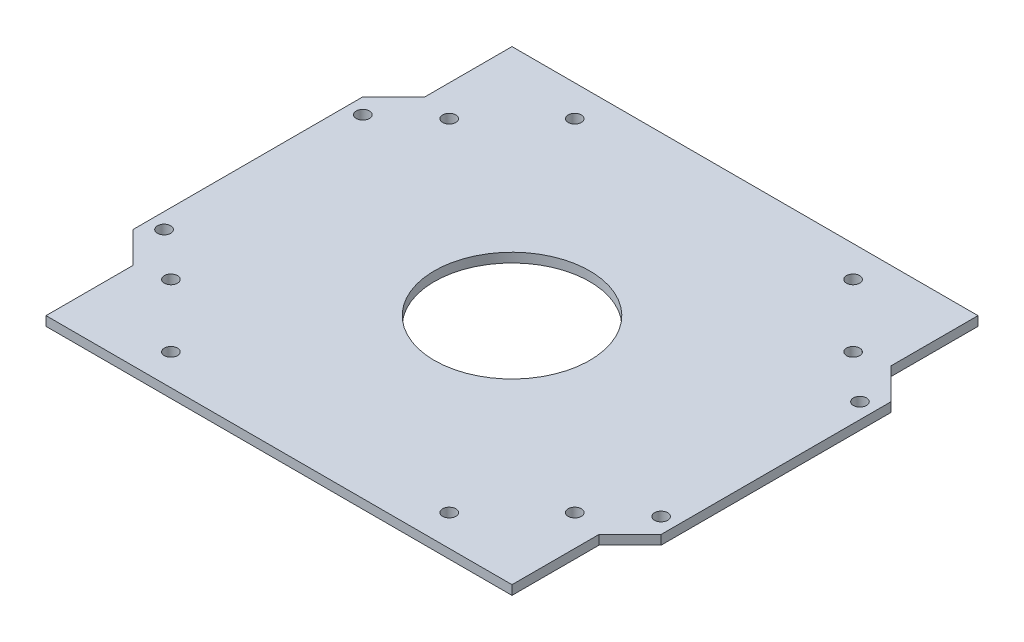
ISO-10303-21;
HEADER;
FILE_DESCRIPTION(('STEP AP214'),'2;1');
FILE_NAME('part.step','',(''),(''),'','','');
FILE_SCHEMA(('AUTOMOTIVE_DESIGN { 1 0 10303 214 1 1 1 1 }'));
ENDSEC;
DATA;
#1=APPLICATION_CONTEXT('core data for automotive mechanical design processes');
#2=APPLICATION_PROTOCOL_DEFINITION('international standard','automotive_design',2000,#1);
#3=PRODUCT_CONTEXT('',#1,'mechanical');
#4=PRODUCT('Part','Part','',(#3));
#5=PRODUCT_RELATED_PRODUCT_CATEGORY('part','',(#4));
#6=PRODUCT_DEFINITION_FORMATION('','',#4);
#7=PRODUCT_DEFINITION_CONTEXT('part definition',#1,'design');
#8=PRODUCT_DEFINITION('design','',#6,#7);
#9=PRODUCT_DEFINITION_SHAPE('','',#8);
#10=(LENGTH_UNIT() NAMED_UNIT(*) SI_UNIT(.MILLI.,.METRE.));
#11=(NAMED_UNIT(*) PLANE_ANGLE_UNIT() SI_UNIT($,.RADIAN.));
#12=(NAMED_UNIT(*) SI_UNIT($,.STERADIAN.) SOLID_ANGLE_UNIT());
#13=UNCERTAINTY_MEASURE_WITH_UNIT(LENGTH_MEASURE(1.E-05),#10,'distance_accuracy_value','');
#14=(GEOMETRIC_REPRESENTATION_CONTEXT(3) GLOBAL_UNCERTAINTY_ASSIGNED_CONTEXT((#13)) GLOBAL_UNIT_ASSIGNED_CONTEXT((#10,
#11,#12)) REPRESENTATION_CONTEXT('',''));
#15=CARTESIAN_POINT('',(0.,0.,0.));
#16=DIRECTION('',(0.,0.,1.));
#17=DIRECTION('',(1.,0.,0.));
#18=AXIS2_PLACEMENT_3D('',#15,#16,#17);
#19=CARTESIAN_POINT('',(75.,3.,75.));
#20=DIRECTION('',(-1.,0.,0.));
#21=DIRECTION('',(0.,0.,1.));
#22=AXIS2_PLACEMENT_3D('',#19,#20,#21);
#23=PLANE('',#22);
#24=DIRECTION('',(0.,1.,0.));
#25=VECTOR('',#24,1.);
#26=CARTESIAN_POINT('',(75.,-14.1421356237309,47.));
#27=LINE('',#26,#25);
#28=CARTESIAN_POINT('',(75.,0.,47.));
#29=VERTEX_POINT('',#28);
#30=CARTESIAN_POINT('',(75.,3.,47.));
#31=VERTEX_POINT('',#30);
#32=EDGE_CURVE('E60',#29,#31,#27,.T.);
#33=ORIENTED_EDGE('',*,*,#32,.T.);
#34=DIRECTION('',(0.,0.,-1.));
#35=VECTOR('',#34,1.);
#36=CARTESIAN_POINT('',(75.,3.,75.));
#37=LINE('',#36,#35);
#38=CARTESIAN_POINT('',(75.,3.,75.));
#39=VERTEX_POINT('',#38);
#40=EDGE_CURVE('E353',#39,#31,#37,.T.);
#41=ORIENTED_EDGE('',*,*,#40,.F.);
#42=DIRECTION('',(0.,-1.,0.));
#43=VECTOR('',#42,1.);
#44=CARTESIAN_POINT('',(75.,3.,75.));
#45=LINE('',#44,#43);
#46=CARTESIAN_POINT('',(75.,0.,75.));
#47=VERTEX_POINT('',#46);
#48=EDGE_CURVE('E172',#39,#47,#45,.T.);
#49=ORIENTED_EDGE('',*,*,#48,.T.);
#50=DIRECTION('',(0.,0.,-1.));
#51=VECTOR('',#50,1.);
#52=CARTESIAN_POINT('',(75.,0.,75.));
#53=LINE('',#52,#51);
#54=EDGE_CURVE('E65',#47,#29,#53,.T.);
#55=ORIENTED_EDGE('',*,*,#54,.T.);
#56=EDGE_LOOP('',(#33,#41,#49,#55));
#57=FACE_BOUND('',#56,.T.);
#58=ADVANCED_FACE('F45',(#57),#23,.F.);
#59=CARTESIAN_POINT('',(-75.,3.,75.));
#60=DIRECTION('',(1.,0.,0.));
#61=DIRECTION('',(0.,0.,-1.));
#62=AXIS2_PLACEMENT_3D('',#59,#60,#61);
#63=PLANE('',#62);
#64=DIRECTION('',(0.,1.,0.));
#65=VECTOR('',#64,1.);
#66=CARTESIAN_POINT('',(-75.,-14.1421356237309,-47.));
#67=LINE('',#66,#65);
#68=CARTESIAN_POINT('',(-75.,0.,-47.));
#69=VERTEX_POINT('',#68);
#70=CARTESIAN_POINT('',(-75.,3.,-47.));
#71=VERTEX_POINT('',#70);
#72=EDGE_CURVE('E205',#69,#71,#67,.T.);
#73=ORIENTED_EDGE('',*,*,#72,.T.);
#74=DIRECTION('',(0.,0.,1.));
#75=VECTOR('',#74,1.);
#76=CARTESIAN_POINT('',(-75.,3.,75.));
#77=LINE('',#76,#75);
#78=CARTESIAN_POINT('',(-75.,3.,-75.));
#79=VERTEX_POINT('',#78);
#80=EDGE_CURVE('E187',#79,#71,#77,.T.);
#81=ORIENTED_EDGE('',*,*,#80,.F.);
#82=DIRECTION('',(0.,-1.,0.));
#83=VECTOR('',#82,1.);
#84=CARTESIAN_POINT('',(-75.,3.,-75.));
#85=LINE('',#84,#83);
#86=CARTESIAN_POINT('',(-75.,0.,-75.));
#87=VERTEX_POINT('',#86);
#88=EDGE_CURVE('E53',#79,#87,#85,.T.);
#89=ORIENTED_EDGE('',*,*,#88,.T.);
#90=DIRECTION('',(0.,0.,1.));
#91=VECTOR('',#90,1.);
#92=CARTESIAN_POINT('',(-75.,0.,75.));
#93=LINE('',#92,#91);
#94=EDGE_CURVE('E161',#87,#69,#93,.T.);
#95=ORIENTED_EDGE('',*,*,#94,.T.);
#96=EDGE_LOOP('',(#73,#81,#89,#95));
#97=FACE_BOUND('',#96,.T.);
#98=ADVANCED_FACE('F184',(#97),#63,.F.);
#99=CARTESIAN_POINT('',(75.,3.,-47.));
#100=VERTEX_POINT('',#99);
#101=CARTESIAN_POINT('',(75.,3.,-75.));
#102=VERTEX_POINT('',#101);
#103=EDGE_CURVE('E171',#100,#102,#37,.T.);
#104=ORIENTED_EDGE('',*,*,#103,.F.);
#105=DIRECTION('',(0.,1.,0.));
#106=VECTOR('',#105,1.);
#107=CARTESIAN_POINT('',(75.,-14.1421356237309,-47.));
#108=LINE('',#107,#106);
#109=CARTESIAN_POINT('',(75.,0.,-47.));
#110=VERTEX_POINT('',#109);
#111=EDGE_CURVE('E218',#110,#100,#108,.T.);
#112=ORIENTED_EDGE('',*,*,#111,.F.);
#113=CARTESIAN_POINT('',(75.,0.,-75.));
#114=VERTEX_POINT('',#113);
#115=EDGE_CURVE('E349',#110,#114,#53,.T.);
#116=ORIENTED_EDGE('',*,*,#115,.T.);
#117=DIRECTION('',(0.,-1.,0.));
#118=VECTOR('',#117,1.);
#119=CARTESIAN_POINT('',(75.,3.,-75.));
#120=LINE('',#119,#118);
#121=EDGE_CURVE('E11',#102,#114,#120,.T.);
#122=ORIENTED_EDGE('',*,*,#121,.F.);
#123=EDGE_LOOP('',(#104,#112,#116,#122));
#124=FACE_BOUND('',#123,.T.);
#125=ADVANCED_FACE('F368',(#124),#23,.F.);
#126=CARTESIAN_POINT('',(-75.,3.,47.));
#127=VERTEX_POINT('',#126);
#128=CARTESIAN_POINT('',(-75.,3.,75.));
#129=VERTEX_POINT('',#128);
#130=EDGE_CURVE('E153',#127,#129,#77,.T.);
#131=ORIENTED_EDGE('',*,*,#130,.F.);
#132=DIRECTION('',(0.,1.,0.));
#133=VECTOR('',#132,1.);
#134=CARTESIAN_POINT('',(-75.,-14.1421356237309,47.));
#135=LINE('',#134,#133);
#136=CARTESIAN_POINT('',(-75.,0.,47.));
#137=VERTEX_POINT('',#136);
#138=EDGE_CURVE('E136',#137,#127,#135,.T.);
#139=ORIENTED_EDGE('',*,*,#138,.F.);
#140=CARTESIAN_POINT('',(-75.,0.,75.));
#141=VERTEX_POINT('',#140);
#142=EDGE_CURVE('E151',#137,#141,#93,.T.);
#143=ORIENTED_EDGE('',*,*,#142,.T.);
#144=DIRECTION('',(0.,-1.,0.));
#145=VECTOR('',#144,1.);
#146=CARTESIAN_POINT('',(-75.,3.,75.));
#147=LINE('',#146,#145);
#148=EDGE_CURVE('E175',#129,#141,#147,.T.);
#149=ORIENTED_EDGE('',*,*,#148,.F.);
#150=EDGE_LOOP('',(#131,#139,#143,#149));
#151=FACE_BOUND('',#150,.T.);
#152=ADVANCED_FACE('F149',(#151),#63,.F.);
#153=CARTESIAN_POINT('',(-75.,3.,-75.));
#154=DIRECTION('',(0.,0.,1.));
#155=DIRECTION('',(1.,0.,0.));
#156=AXIS2_PLACEMENT_3D('',#153,#154,#155);
#157=PLANE('',#156);
#158=DIRECTION('',(-1.,0.,0.));
#159=VECTOR('',#158,1.);
#160=CARTESIAN_POINT('',(-75.,0.,-75.));
#161=LINE('',#160,#159);
#162=EDGE_CURVE('E162',#114,#87,#161,.T.);
#163=ORIENTED_EDGE('',*,*,#162,.T.);
#164=ORIENTED_EDGE('',*,*,#88,.F.);
#165=DIRECTION('',(-1.,0.,0.));
#166=VECTOR('',#165,1.);
#167=CARTESIAN_POINT('',(-75.,3.,-75.));
#168=LINE('',#167,#166);
#169=EDGE_CURVE('E356',#102,#79,#168,.T.);
#170=ORIENTED_EDGE('',*,*,#169,.F.);
#171=ORIENTED_EDGE('',*,*,#121,.T.);
#172=EDGE_LOOP('',(#163,#164,#170,#171));
#173=FACE_BOUND('',#172,.T.);
#174=ADVANCED_FACE('F394',(#173),#157,.F.);
#175=CARTESIAN_POINT('',(-75.,3.,75.));
#176=DIRECTION('',(0.,0.,-1.));
#177=DIRECTION('',(-1.,0.,0.));
#178=AXIS2_PLACEMENT_3D('',#175,#176,#177);
#179=PLANE('',#178);
#180=DIRECTION('',(1.,0.,0.));
#181=VECTOR('',#180,1.);
#182=CARTESIAN_POINT('',(-75.,0.,75.));
#183=LINE('',#182,#181);
#184=EDGE_CURVE('E159',#141,#47,#183,.T.);
#185=ORIENTED_EDGE('',*,*,#184,.T.);
#186=ORIENTED_EDGE('',*,*,#48,.F.);
#187=DIRECTION('',(1.,0.,0.));
#188=VECTOR('',#187,1.);
#189=CARTESIAN_POINT('',(-75.,3.,75.));
#190=LINE('',#189,#188);
#191=EDGE_CURVE('E176',#129,#39,#190,.T.);
#192=ORIENTED_EDGE('',*,*,#191,.F.);
#193=ORIENTED_EDGE('',*,*,#148,.T.);
#194=EDGE_LOOP('',(#185,#186,#192,#193));
#195=FACE_BOUND('',#194,.T.);
#196=ADVANCED_FACE('F396',(#195),#179,.F.);
#197=CARTESIAN_POINT('',(0.,3.,0.));
#198=DIRECTION('',(0.,-1.,0.));
#199=DIRECTION('',(0.,0.,-1.));
#200=AXIS2_PLACEMENT_3D('',#197,#198,#199);
#201=PLANE('',#200);
#202=DIRECTION('',(0.707106781186547,0.,0.707106781186548));
#203=VECTOR('',#202,1.);
#204=CARTESIAN_POINT('',(-85.,3.,37.));
#205=LINE('',#204,#203);
#206=CARTESIAN_POINT('',(-85.,3.,37.));
#207=VERTEX_POINT('',#206);
#208=EDGE_CURVE('E145',#207,#127,#205,.T.);
#209=ORIENTED_EDGE('',*,*,#208,.T.);
#210=ORIENTED_EDGE('',*,*,#130,.T.);
#211=ORIENTED_EDGE('',*,*,#191,.T.);
#212=ORIENTED_EDGE('',*,*,#40,.T.);
#213=DIRECTION('',(-0.707106781186547,0.,0.707106781186548));
#214=VECTOR('',#213,1.);
#215=CARTESIAN_POINT('',(85.,3.,37.));
#216=LINE('',#215,#214);
#217=CARTESIAN_POINT('',(85.,3.,37.));
#218=VERTEX_POINT('',#217);
#219=EDGE_CURVE('E200',#218,#31,#216,.T.);
#220=ORIENTED_EDGE('',*,*,#219,.F.);
#221=DIRECTION('',(0.,0.,-1.));
#222=VECTOR('',#221,1.);
#223=CARTESIAN_POINT('',(85.,3.,37.));
#224=LINE('',#223,#222);
#225=CARTESIAN_POINT('',(85.,3.,-37.));
#226=VERTEX_POINT('',#225);
#227=EDGE_CURVE('E239',#218,#226,#224,.T.);
#228=ORIENTED_EDGE('',*,*,#227,.T.);
#229=DIRECTION('',(-0.707106781186547,0.,-0.707106781186548));
#230=VECTOR('',#229,1.);
#231=CARTESIAN_POINT('',(85.,3.,-37.));
#232=LINE('',#231,#230);
#233=EDGE_CURVE('E211',#226,#100,#232,.T.);
#234=ORIENTED_EDGE('',*,*,#233,.T.);
#235=ORIENTED_EDGE('',*,*,#103,.T.);
#236=ORIENTED_EDGE('',*,*,#169,.T.);
#237=ORIENTED_EDGE('',*,*,#80,.T.);
#238=DIRECTION('',(0.707106781186547,0.,-0.707106781186548));
#239=VECTOR('',#238,1.);
#240=CARTESIAN_POINT('',(-85.,3.,-37.));
#241=LINE('',#240,#239);
#242=CARTESIAN_POINT('',(-85.,3.,-37.));
#243=VERTEX_POINT('',#242);
#244=EDGE_CURVE('E199',#243,#71,#241,.T.);
#245=ORIENTED_EDGE('',*,*,#244,.F.);
#246=DIRECTION('',(0.,0.,1.));
#247=VECTOR('',#246,1.);
#248=CARTESIAN_POINT('',(-85.,3.,37.));
#249=LINE('',#248,#247);
#250=EDGE_CURVE('E253',#243,#207,#249,.T.);
#251=ORIENTED_EDGE('',*,*,#250,.T.);
#252=EDGE_LOOP('',(#209,#210,#211,#212,#220,#228,#234,#235,#236,#237,#245,#251));
#253=FACE_BOUND('',#252,.T.);
#254=CARTESIAN_POINT('',(-65.,3.,-44.8000000000001));
#255=DIRECTION('',(0.,1.,0.));
#256=DIRECTION('',(0.,0.,-1.));
#257=AXIS2_PLACEMENT_3D('',#254,#255,#256);
#258=CIRCLE('',#257,2.125);
#259=CARTESIAN_POINT('',(-65.,3.,-46.9250000000001));
#260=VERTEX_POINT('',#259);
#261=EDGE_CURVE('E313',#260,#260,#258,.T.);
#262=ORIENTED_EDGE('',*,*,#261,.F.);
#263=EDGE_LOOP('',(#262));
#264=FACE_BOUND('',#263,.T.);
#265=CARTESIAN_POINT('',(0.,3.,0.));
#266=DIRECTION('',(0.,1.,0.));
#267=DIRECTION('',(0.,0.,1.));
#268=AXIS2_PLACEMENT_3D('',#265,#266,#267);
#269=CIRCLE('',#268,25.);
#270=CARTESIAN_POINT('',(0.,3.,25.));
#271=VERTEX_POINT('',#270);
#272=EDGE_CURVE('E322',#271,#271,#269,.T.);
#273=ORIENTED_EDGE('',*,*,#272,.F.);
#274=EDGE_LOOP('',(#273));
#275=FACE_BOUND('',#274,.T.);
#276=CARTESIAN_POINT('',(-44.8000000000001,3.,-65.));
#277=DIRECTION('',(0.,1.,0.));
#278=DIRECTION('',(0.,0.,1.));
#279=AXIS2_PLACEMENT_3D('',#276,#277,#278);
#280=CIRCLE('',#279,2.125);
#281=CARTESIAN_POINT('',(-44.8000000000001,3.,-62.875));
#282=VERTEX_POINT('',#281);
#283=EDGE_CURVE('E330',#282,#282,#280,.T.);
#284=ORIENTED_EDGE('',*,*,#283,.F.);
#285=EDGE_LOOP('',(#284));
#286=FACE_BOUND('',#285,.T.);
#287=CARTESIAN_POINT('',(44.8000000000001,3.,-65.));
#288=DIRECTION('',(0.,1.,0.));
#289=DIRECTION('',(0.,0.,-1.));
#290=AXIS2_PLACEMENT_3D('',#287,#288,#289);
#291=CIRCLE('',#290,2.125);
#292=CARTESIAN_POINT('',(44.8000000000001,3.,-67.125));
#293=VERTEX_POINT('',#292);
#294=EDGE_CURVE('E338',#293,#293,#291,.T.);
#295=ORIENTED_EDGE('',*,*,#294,.F.);
#296=EDGE_LOOP('',(#295));
#297=FACE_BOUND('',#296,.T.);
#298=CARTESIAN_POINT('',(65.,3.,-44.8000000000001));
#299=DIRECTION('',(0.,1.,0.));
#300=DIRECTION('',(0.,0.,1.));
#301=AXIS2_PLACEMENT_3D('',#298,#299,#300);
#302=CIRCLE('',#301,2.12500000000002);
#303=CARTESIAN_POINT('',(65.,3.,-42.6750000000001));
#304=VERTEX_POINT('',#303);
#305=EDGE_CURVE('E281',#304,#304,#302,.T.);
#306=ORIENTED_EDGE('',*,*,#305,.F.);
#307=EDGE_LOOP('',(#306));
#308=FACE_BOUND('',#307,.T.);
#309=CARTESIAN_POINT('',(65.,3.,44.8000000000001));
#310=DIRECTION('',(0.,1.,0.));
#311=DIRECTION('',(0.,0.,-1.));
#312=AXIS2_PLACEMENT_3D('',#309,#310,#311);
#313=CIRCLE('',#312,2.12499999999999);
#314=CARTESIAN_POINT('',(65.,3.,42.6750000000001));
#315=VERTEX_POINT('',#314);
#316=EDGE_CURVE('E290',#315,#315,#313,.T.);
#317=ORIENTED_EDGE('',*,*,#316,.F.);
#318=EDGE_LOOP('',(#317));
#319=FACE_BOUND('',#318,.T.);
#320=CARTESIAN_POINT('',(44.8000000000001,3.,65.));
#321=DIRECTION('',(0.,1.,0.));
#322=DIRECTION('',(0.,0.,1.));
#323=AXIS2_PLACEMENT_3D('',#320,#321,#322);
#324=CIRCLE('',#323,2.125);
#325=CARTESIAN_POINT('',(44.8000000000001,3.,67.125));
#326=VERTEX_POINT('',#325);
#327=EDGE_CURVE('E298',#326,#326,#324,.T.);
#328=ORIENTED_EDGE('',*,*,#327,.F.);
#329=EDGE_LOOP('',(#328));
#330=FACE_BOUND('',#329,.T.);
#331=CARTESIAN_POINT('',(-44.8000000000001,3.,65.));
#332=DIRECTION('',(0.,1.,0.));
#333=DIRECTION('',(0.,0.,-1.));
#334=AXIS2_PLACEMENT_3D('',#331,#332,#333);
#335=CIRCLE('',#334,2.12500000000001);
#336=CARTESIAN_POINT('',(-44.8000000000001,3.,62.875));
#337=VERTEX_POINT('',#336);
#338=EDGE_CURVE('E306',#337,#337,#335,.T.);
#339=ORIENTED_EDGE('',*,*,#338,.F.);
#340=EDGE_LOOP('',(#339));
#341=FACE_BOUND('',#340,.T.);
#342=CARTESIAN_POINT('',(-65.,3.,44.8000000000001));
#343=DIRECTION('',(0.,1.,0.));
#344=DIRECTION('',(0.,0.,1.));
#345=AXIS2_PLACEMENT_3D('',#342,#343,#344);
#346=CIRCLE('',#345,2.125);
#347=CARTESIAN_POINT('',(-65.,3.,46.9250000000001));
#348=VERTEX_POINT('',#347);
#349=EDGE_CURVE('E317',#348,#348,#346,.T.);
#350=ORIENTED_EDGE('',*,*,#349,.F.);
#351=EDGE_LOOP('',(#350));
#352=FACE_BOUND('',#351,.T.);
#353=CARTESIAN_POINT('',(-80.,3.,32.));
#354=DIRECTION('',(0.,1.,0.));
#355=DIRECTION('',(0.,0.,-1.));
#356=AXIS2_PLACEMENT_3D('',#353,#354,#355);
#357=CIRCLE('',#356,2.125);
#358=CARTESIAN_POINT('',(-80.,3.,29.875));
#359=VERTEX_POINT('',#358);
#360=EDGE_CURVE('E258',#359,#359,#357,.T.);
#361=ORIENTED_EDGE('',*,*,#360,.F.);
#362=EDGE_LOOP('',(#361));
#363=FACE_BOUND('',#362,.T.);
#364=CARTESIAN_POINT('',(-80.,3.,-32.));
#365=DIRECTION('',(0.,1.,0.));
#366=DIRECTION('',(0.,0.,1.));
#367=AXIS2_PLACEMENT_3D('',#364,#365,#366);
#368=CIRCLE('',#367,2.125);
#369=CARTESIAN_POINT('',(-80.,3.,-29.875));
#370=VERTEX_POINT('',#369);
#371=EDGE_CURVE('E259',#370,#370,#368,.T.);
#372=ORIENTED_EDGE('',*,*,#371,.F.);
#373=EDGE_LOOP('',(#372));
#374=FACE_BOUND('',#373,.T.);
#375=CARTESIAN_POINT('',(80.,3.,-32.));
#376=DIRECTION('',(0.,1.,0.));
#377=DIRECTION('',(0.,0.,-1.));
#378=AXIS2_PLACEMENT_3D('',#375,#376,#377);
#379=CIRCLE('',#378,2.125);
#380=CARTESIAN_POINT('',(80.,3.,-34.125));
#381=VERTEX_POINT('',#380);
#382=EDGE_CURVE('E243',#381,#381,#379,.T.);
#383=ORIENTED_EDGE('',*,*,#382,.F.);
#384=EDGE_LOOP('',(#383));
#385=FACE_BOUND('',#384,.T.);
#386=CARTESIAN_POINT('',(80.,3.,32.));
#387=DIRECTION('',(0.,1.,0.));
#388=DIRECTION('',(0.,0.,1.));
#389=AXIS2_PLACEMENT_3D('',#386,#387,#388);
#390=CIRCLE('',#389,2.125);
#391=CARTESIAN_POINT('',(80.,3.,34.125));
#392=VERTEX_POINT('',#391);
#393=EDGE_CURVE('E231',#392,#392,#390,.T.);
#394=ORIENTED_EDGE('',*,*,#393,.F.);
#395=EDGE_LOOP('',(#394));
#396=FACE_BOUND('',#395,.T.);
#397=ADVANCED_FACE('F388',(#253,#264,#275,#286,#297,#308,#319,#330,#341,#352,#363,#374,#385,
#396),#201,.F.);
#398=CARTESIAN_POINT('',(0.,0.,0.));
#399=DIRECTION('',(0.,-1.,0.));
#400=DIRECTION('',(0.,0.,-1.));
#401=AXIS2_PLACEMENT_3D('',#398,#399,#400);
#402=PLANE('',#401);
#403=ORIENTED_EDGE('',*,*,#142,.F.);
#404=DIRECTION('',(0.707106781186547,0.,0.707106781186548));
#405=VECTOR('',#404,1.);
#406=CARTESIAN_POINT('',(-85.,0.,37.));
#407=LINE('',#406,#405);
#408=CARTESIAN_POINT('',(-85.,0.,37.));
#409=VERTEX_POINT('',#408);
#410=EDGE_CURVE('E133',#409,#137,#407,.T.);
#411=ORIENTED_EDGE('',*,*,#410,.F.);
#412=DIRECTION('',(0.,0.,1.));
#413=VECTOR('',#412,1.);
#414=CARTESIAN_POINT('',(-85.,0.,37.));
#415=LINE('',#414,#413);
#416=CARTESIAN_POINT('',(-85.,0.,-37.));
#417=VERTEX_POINT('',#416);
#418=EDGE_CURVE('E195',#417,#409,#415,.T.);
#419=ORIENTED_EDGE('',*,*,#418,.F.);
#420=DIRECTION('',(0.707106781186547,0.,-0.707106781186548));
#421=VECTOR('',#420,1.);
#422=CARTESIAN_POINT('',(-85.,0.,-37.));
#423=LINE('',#422,#421);
#424=EDGE_CURVE('E194',#417,#69,#423,.T.);
#425=ORIENTED_EDGE('',*,*,#424,.T.);
#426=ORIENTED_EDGE('',*,*,#94,.F.);
#427=ORIENTED_EDGE('',*,*,#162,.F.);
#428=ORIENTED_EDGE('',*,*,#115,.F.);
#429=DIRECTION('',(-0.707106781186547,0.,-0.707106781186548));
#430=VECTOR('',#429,1.);
#431=CARTESIAN_POINT('',(85.,0.,-37.));
#432=LINE('',#431,#430);
#433=CARTESIAN_POINT('',(85.,0.,-37.));
#434=VERTEX_POINT('',#433);
#435=EDGE_CURVE('E215',#434,#110,#432,.T.);
#436=ORIENTED_EDGE('',*,*,#435,.F.);
#437=DIRECTION('',(0.,0.,-1.));
#438=VECTOR('',#437,1.);
#439=CARTESIAN_POINT('',(85.,0.,37.));
#440=LINE('',#439,#438);
#441=CARTESIAN_POINT('',(85.,0.,37.));
#442=VERTEX_POINT('',#441);
#443=EDGE_CURVE('E226',#442,#434,#440,.T.);
#444=ORIENTED_EDGE('',*,*,#443,.F.);
#445=DIRECTION('',(-0.707106781186547,0.,0.707106781186548));
#446=VECTOR('',#445,1.);
#447=CARTESIAN_POINT('',(85.,0.,37.));
#448=LINE('',#447,#446);
#449=EDGE_CURVE('E379',#442,#29,#448,.T.);
#450=ORIENTED_EDGE('',*,*,#449,.T.);
#451=ORIENTED_EDGE('',*,*,#54,.F.);
#452=ORIENTED_EDGE('',*,*,#184,.F.);
#453=EDGE_LOOP('',(#403,#411,#419,#425,#426,#427,#428,#436,#444,#450,#451,#452));
#454=FACE_BOUND('',#453,.T.);
#455=CARTESIAN_POINT('',(-65.,0.,-44.8000000000001));
#456=DIRECTION('',(0.,1.,0.));
#457=DIRECTION('',(0.,0.,-1.));
#458=AXIS2_PLACEMENT_3D('',#455,#456,#457);
#459=CIRCLE('',#458,2.125);
#460=CARTESIAN_POINT('',(-65.,0.,-46.9250000000001));
#461=VERTEX_POINT('',#460);
#462=EDGE_CURVE('E318',#461,#461,#459,.T.);
#463=ORIENTED_EDGE('',*,*,#462,.T.);
#464=EDGE_LOOP('',(#463));
#465=FACE_BOUND('',#464,.T.);
#466=CARTESIAN_POINT('',(0.,0.,0.));
#467=DIRECTION('',(0.,1.,0.));
#468=DIRECTION('',(0.,0.,1.));
#469=AXIS2_PLACEMENT_3D('',#466,#467,#468);
#470=CIRCLE('',#469,25.);
#471=CARTESIAN_POINT('',(0.,0.,25.));
#472=VERTEX_POINT('',#471);
#473=EDGE_CURVE('E326',#472,#472,#470,.T.);
#474=ORIENTED_EDGE('',*,*,#473,.T.);
#475=EDGE_LOOP('',(#474));
#476=FACE_BOUND('',#475,.T.);
#477=CARTESIAN_POINT('',(-44.8000000000001,0.,-65.));
#478=DIRECTION('',(0.,1.,0.));
#479=DIRECTION('',(0.,0.,1.));
#480=AXIS2_PLACEMENT_3D('',#477,#478,#479);
#481=CIRCLE('',#480,2.125);
#482=CARTESIAN_POINT('',(-44.8000000000001,0.,-62.875));
#483=VERTEX_POINT('',#482);
#484=EDGE_CURVE('E334',#483,#483,#481,.T.);
#485=ORIENTED_EDGE('',*,*,#484,.T.);
#486=EDGE_LOOP('',(#485));
#487=FACE_BOUND('',#486,.T.);
#488=CARTESIAN_POINT('',(44.8000000000001,0.,-65.));
#489=DIRECTION('',(0.,1.,0.));
#490=DIRECTION('',(0.,0.,-1.));
#491=AXIS2_PLACEMENT_3D('',#488,#489,#490);
#492=CIRCLE('',#491,2.125);
#493=CARTESIAN_POINT('',(44.8000000000001,0.,-67.125));
#494=VERTEX_POINT('',#493);
#495=EDGE_CURVE('E285',#494,#494,#492,.T.);
#496=ORIENTED_EDGE('',*,*,#495,.T.);
#497=EDGE_LOOP('',(#496));
#498=FACE_BOUND('',#497,.T.);
#499=CARTESIAN_POINT('',(65.,0.,-44.8000000000001));
#500=DIRECTION('',(0.,1.,0.));
#501=DIRECTION('',(0.,0.,1.));
#502=AXIS2_PLACEMENT_3D('',#499,#500,#501);
#503=CIRCLE('',#502,2.12500000000002);
#504=CARTESIAN_POINT('',(65.,0.,-42.6750000000001));
#505=VERTEX_POINT('',#504);
#506=EDGE_CURVE('E286',#505,#505,#503,.T.);
#507=ORIENTED_EDGE('',*,*,#506,.T.);
#508=EDGE_LOOP('',(#507));
#509=FACE_BOUND('',#508,.T.);
#510=CARTESIAN_POINT('',(65.,0.,44.8000000000001));
#511=DIRECTION('',(0.,1.,0.));
#512=DIRECTION('',(0.,0.,-1.));
#513=AXIS2_PLACEMENT_3D('',#510,#511,#512);
#514=CIRCLE('',#513,2.12499999999999);
#515=CARTESIAN_POINT('',(65.,0.,42.6750000000001));
#516=VERTEX_POINT('',#515);
#517=EDGE_CURVE('E294',#516,#516,#514,.T.);
#518=ORIENTED_EDGE('',*,*,#517,.T.);
#519=EDGE_LOOP('',(#518));
#520=FACE_BOUND('',#519,.T.);
#521=CARTESIAN_POINT('',(44.8000000000001,0.,65.));
#522=DIRECTION('',(0.,1.,0.));
#523=DIRECTION('',(0.,0.,1.));
#524=AXIS2_PLACEMENT_3D('',#521,#522,#523);
#525=CIRCLE('',#524,2.125);
#526=CARTESIAN_POINT('',(44.8000000000001,0.,67.125));
#527=VERTEX_POINT('',#526);
#528=EDGE_CURVE('E302',#527,#527,#525,.T.);
#529=ORIENTED_EDGE('',*,*,#528,.T.);
#530=EDGE_LOOP('',(#529));
#531=FACE_BOUND('',#530,.T.);
#532=CARTESIAN_POINT('',(-44.8000000000001,0.,65.));
#533=DIRECTION('',(0.,1.,0.));
#534=DIRECTION('',(0.,0.,-1.));
#535=AXIS2_PLACEMENT_3D('',#532,#533,#534);
#536=CIRCLE('',#535,2.12500000000001);
#537=CARTESIAN_POINT('',(-44.8000000000001,0.,62.875));
#538=VERTEX_POINT('',#537);
#539=EDGE_CURVE('E271',#538,#538,#536,.T.);
#540=ORIENTED_EDGE('',*,*,#539,.T.);
#541=EDGE_LOOP('',(#540));
#542=FACE_BOUND('',#541,.T.);
#543=CARTESIAN_POINT('',(-65.,0.,44.8000000000001));
#544=DIRECTION('',(0.,1.,0.));
#545=DIRECTION('',(0.,0.,1.));
#546=AXIS2_PLACEMENT_3D('',#543,#544,#545);
#547=CIRCLE('',#546,2.125);
#548=CARTESIAN_POINT('',(-65.,0.,46.9250000000001));
#549=VERTEX_POINT('',#548);
#550=EDGE_CURVE('E345',#549,#549,#547,.T.);
#551=ORIENTED_EDGE('',*,*,#550,.T.);
#552=EDGE_LOOP('',(#551));
#553=FACE_BOUND('',#552,.T.);
#554=CARTESIAN_POINT('',(-80.,0.,32.));
#555=DIRECTION('',(0.,-1.,0.));
#556=DIRECTION('',(0.,0.,-1.));
#557=AXIS2_PLACEMENT_3D('',#554,#555,#556);
#558=CIRCLE('',#557,2.125);
#559=CARTESIAN_POINT('',(-80.,0.,29.875));
#560=VERTEX_POINT('',#559);
#561=EDGE_CURVE('E257',#560,#560,#558,.F.);
#562=ORIENTED_EDGE('',*,*,#561,.T.);
#563=EDGE_LOOP('',(#562));
#564=FACE_BOUND('',#563,.T.);
#565=CARTESIAN_POINT('',(-80.,0.,-32.));
#566=DIRECTION('',(0.,-1.,0.));
#567=DIRECTION('',(0.,0.,-1.));
#568=AXIS2_PLACEMENT_3D('',#565,#566,#567);
#569=CIRCLE('',#568,2.125);
#570=CARTESIAN_POINT('',(-80.,0.,-34.125));
#571=VERTEX_POINT('',#570);
#572=EDGE_CURVE('E267',#571,#571,#569,.F.);
#573=ORIENTED_EDGE('',*,*,#572,.T.);
#574=EDGE_LOOP('',(#573));
#575=FACE_BOUND('',#574,.T.);
#576=CARTESIAN_POINT('',(80.,0.,-32.));
#577=DIRECTION('',(0.,-1.,0.));
#578=DIRECTION('',(0.,0.,-1.));
#579=AXIS2_PLACEMENT_3D('',#576,#577,#578);
#580=CIRCLE('',#579,2.125);
#581=CARTESIAN_POINT('',(80.,0.,-34.125));
#582=VERTEX_POINT('',#581);
#583=EDGE_CURVE('E235',#582,#582,#580,.F.);
#584=ORIENTED_EDGE('',*,*,#583,.T.);
#585=EDGE_LOOP('',(#584));
#586=FACE_BOUND('',#585,.T.);
#587=CARTESIAN_POINT('',(80.,0.,32.));
#588=DIRECTION('',(0.,-1.,0.));
#589=DIRECTION('',(0.,0.,-1.));
#590=AXIS2_PLACEMENT_3D('',#587,#588,#589);
#591=CIRCLE('',#590,2.125);
#592=CARTESIAN_POINT('',(80.,0.,29.875));
#593=VERTEX_POINT('',#592);
#594=EDGE_CURVE('E221',#593,#593,#591,.F.);
#595=ORIENTED_EDGE('',*,*,#594,.T.);
#596=EDGE_LOOP('',(#595));
#597=FACE_BOUND('',#596,.T.);
#598=ADVANCED_FACE('F157',(#454,#465,#476,#487,#498,#509,#520,#531,#542,#553,#564,#575,#586,
#597),#402,.T.);
#599=CARTESIAN_POINT('',(-65.,0.,44.8000000000001));
#600=DIRECTION('',(0.,1.,0.));
#601=DIRECTION('',(0.,0.,1.));
#602=AXIS2_PLACEMENT_3D('',#599,#600,#601);
#603=CYLINDRICAL_SURFACE('',#602,2.125);
#604=ORIENTED_EDGE('',*,*,#550,.F.);
#605=EDGE_LOOP('',(#604));
#606=FACE_BOUND('',#605,.T.);
#607=ORIENTED_EDGE('',*,*,#349,.T.);
#608=EDGE_LOOP('',(#607));
#609=FACE_BOUND('',#608,.T.);
#610=ADVANCED_FACE('F436',(#606,#609),#603,.F.);
#611=CARTESIAN_POINT('',(-44.8000000000001,0.,65.));
#612=DIRECTION('',(0.,1.,0.));
#613=DIRECTION('',(0.,0.,1.));
#614=AXIS2_PLACEMENT_3D('',#611,#612,#613);
#615=CYLINDRICAL_SURFACE('',#614,2.12500000000001);
#616=ORIENTED_EDGE('',*,*,#539,.F.);
#617=EDGE_LOOP('',(#616));
#618=FACE_BOUND('',#617,.T.);
#619=ORIENTED_EDGE('',*,*,#338,.T.);
#620=EDGE_LOOP('',(#619));
#621=FACE_BOUND('',#620,.T.);
#622=ADVANCED_FACE('F594',(#618,#621),#615,.F.);
#623=CARTESIAN_POINT('',(44.8000000000001,0.,65.));
#624=DIRECTION('',(0.,1.,0.));
#625=DIRECTION('',(0.,0.,1.));
#626=AXIS2_PLACEMENT_3D('',#623,#624,#625);
#627=CYLINDRICAL_SURFACE('',#626,2.125);
#628=ORIENTED_EDGE('',*,*,#528,.F.);
#629=EDGE_LOOP('',(#628));
#630=FACE_BOUND('',#629,.T.);
#631=ORIENTED_EDGE('',*,*,#327,.T.);
#632=EDGE_LOOP('',(#631));
#633=FACE_BOUND('',#632,.T.);
#634=ADVANCED_FACE('F585',(#630,#633),#627,.F.);
#635=CARTESIAN_POINT('',(65.,0.,44.8000000000001));
#636=DIRECTION('',(0.,1.,0.));
#637=DIRECTION('',(0.,0.,1.));
#638=AXIS2_PLACEMENT_3D('',#635,#636,#637);
#639=CYLINDRICAL_SURFACE('',#638,2.12499999999999);
#640=ORIENTED_EDGE('',*,*,#517,.F.);
#641=EDGE_LOOP('',(#640));
#642=FACE_BOUND('',#641,.T.);
#643=ORIENTED_EDGE('',*,*,#316,.T.);
#644=EDGE_LOOP('',(#643));
#645=FACE_BOUND('',#644,.T.);
#646=ADVANCED_FACE('F576',(#642,#645),#639,.F.);
#647=CARTESIAN_POINT('',(65.,0.,-44.8000000000001));
#648=DIRECTION('',(0.,1.,0.));
#649=DIRECTION('',(0.,0.,1.));
#650=AXIS2_PLACEMENT_3D('',#647,#648,#649);
#651=CYLINDRICAL_SURFACE('',#650,2.12500000000002);
#652=ORIENTED_EDGE('',*,*,#506,.F.);
#653=EDGE_LOOP('',(#652));
#654=FACE_BOUND('',#653,.T.);
#655=ORIENTED_EDGE('',*,*,#305,.T.);
#656=EDGE_LOOP('',(#655));
#657=FACE_BOUND('',#656,.T.);
#658=ADVANCED_FACE('F567',(#654,#657),#651,.F.);
#659=CARTESIAN_POINT('',(44.8000000000001,0.,-65.));
#660=DIRECTION('',(0.,1.,0.));
#661=DIRECTION('',(0.,0.,1.));
#662=AXIS2_PLACEMENT_3D('',#659,#660,#661);
#663=CYLINDRICAL_SURFACE('',#662,2.125);
#664=ORIENTED_EDGE('',*,*,#495,.F.);
#665=EDGE_LOOP('',(#664));
#666=FACE_BOUND('',#665,.T.);
#667=ORIENTED_EDGE('',*,*,#294,.T.);
#668=EDGE_LOOP('',(#667));
#669=FACE_BOUND('',#668,.T.);
#670=ADVANCED_FACE('F558',(#666,#669),#663,.F.);
#671=CARTESIAN_POINT('',(-44.8000000000001,0.,-65.));
#672=DIRECTION('',(0.,1.,0.));
#673=DIRECTION('',(0.,0.,1.));
#674=AXIS2_PLACEMENT_3D('',#671,#672,#673);
#675=CYLINDRICAL_SURFACE('',#674,2.125);
#676=ORIENTED_EDGE('',*,*,#484,.F.);
#677=EDGE_LOOP('',(#676));
#678=FACE_BOUND('',#677,.T.);
#679=ORIENTED_EDGE('',*,*,#283,.T.);
#680=EDGE_LOOP('',(#679));
#681=FACE_BOUND('',#680,.T.);
#682=ADVANCED_FACE('F549',(#678,#681),#675,.F.);
#683=CARTESIAN_POINT('',(0.,0.,0.));
#684=DIRECTION('',(0.,1.,0.));
#685=DIRECTION('',(0.,0.,1.));
#686=AXIS2_PLACEMENT_3D('',#683,#684,#685);
#687=CYLINDRICAL_SURFACE('',#686,25.);
#688=ORIENTED_EDGE('',*,*,#473,.F.);
#689=EDGE_LOOP('',(#688));
#690=FACE_BOUND('',#689,.T.);
#691=ORIENTED_EDGE('',*,*,#272,.T.);
#692=EDGE_LOOP('',(#691));
#693=FACE_BOUND('',#692,.T.);
#694=ADVANCED_FACE('F540',(#690,#693),#687,.F.);
#695=CARTESIAN_POINT('',(-65.,0.,-44.8000000000001));
#696=DIRECTION('',(0.,1.,0.));
#697=DIRECTION('',(0.,0.,1.));
#698=AXIS2_PLACEMENT_3D('',#695,#696,#697);
#699=CYLINDRICAL_SURFACE('',#698,2.125);
#700=ORIENTED_EDGE('',*,*,#462,.F.);
#701=EDGE_LOOP('',(#700));
#702=FACE_BOUND('',#701,.T.);
#703=ORIENTED_EDGE('',*,*,#261,.T.);
#704=EDGE_LOOP('',(#703));
#705=FACE_BOUND('',#704,.T.);
#706=ADVANCED_FACE('F446',(#702,#705),#699,.F.);
#707=CARTESIAN_POINT('',(-85.,-74.6726188103779,37.));
#708=DIRECTION('',(-1.,0.,0.));
#709=DIRECTION('',(0.,0.,1.));
#710=AXIS2_PLACEMENT_3D('',#707,#708,#709);
#711=PLANE('',#710);
#712=DIRECTION('',(0.,1.,0.));
#713=VECTOR('',#712,1.);
#714=CARTESIAN_POINT('',(-85.,-74.6726188103779,-37.));
#715=LINE('',#714,#713);
#716=EDGE_CURVE('E263',#417,#243,#715,.T.);
#717=ORIENTED_EDGE('',*,*,#716,.F.);
#718=ORIENTED_EDGE('',*,*,#418,.T.);
#719=DIRECTION('',(0.,1.,0.));
#720=VECTOR('',#719,1.);
#721=CARTESIAN_POINT('',(-85.,-74.6726188103779,37.));
#722=LINE('',#721,#720);
#723=EDGE_CURVE('E139',#409,#207,#722,.T.);
#724=ORIENTED_EDGE('',*,*,#723,.T.);
#725=ORIENTED_EDGE('',*,*,#250,.F.);
#726=EDGE_LOOP('',(#717,#718,#724,#725));
#727=FACE_BOUND('',#726,.T.);
#728=ADVANCED_FACE('F392',(#727),#711,.T.);
#729=CARTESIAN_POINT('',(-80.,-74.6726188103779,-32.));
#730=DIRECTION('',(0.,1.,0.));
#731=DIRECTION('',(0.,0.,1.));
#732=AXIS2_PLACEMENT_3D('',#729,#730,#731);
#733=CYLINDRICAL_SURFACE('',#732,2.125);
#734=ORIENTED_EDGE('',*,*,#371,.T.);
#735=EDGE_LOOP('',(#734));
#736=FACE_BOUND('',#735,.T.);
#737=ORIENTED_EDGE('',*,*,#572,.F.);
#738=EDGE_LOOP('',(#737));
#739=FACE_BOUND('',#738,.T.);
#740=ADVANCED_FACE('F445',(#736,#739),#733,.F.);
#741=CARTESIAN_POINT('',(-80.,-74.6726188103779,32.));
#742=DIRECTION('',(0.,1.,0.));
#743=DIRECTION('',(0.,0.,1.));
#744=AXIS2_PLACEMENT_3D('',#741,#742,#743);
#745=CYLINDRICAL_SURFACE('',#744,2.125);
#746=ORIENTED_EDGE('',*,*,#360,.T.);
#747=EDGE_LOOP('',(#746));
#748=FACE_BOUND('',#747,.T.);
#749=ORIENTED_EDGE('',*,*,#561,.F.);
#750=EDGE_LOOP('',(#749));
#751=FACE_BOUND('',#750,.T.);
#752=ADVANCED_FACE('F457',(#748,#751),#745,.F.);
#753=CARTESIAN_POINT('',(85.,-74.6726188103779,37.));
#754=DIRECTION('',(1.,0.,0.));
#755=DIRECTION('',(0.,0.,-1.));
#756=AXIS2_PLACEMENT_3D('',#753,#754,#755);
#757=PLANE('',#756);
#758=DIRECTION('',(0.,1.,0.));
#759=VECTOR('',#758,1.);
#760=CARTESIAN_POINT('',(85.,-74.6726188103779,37.));
#761=LINE('',#760,#759);
#762=EDGE_CURVE('E222',#442,#218,#761,.T.);
#763=ORIENTED_EDGE('',*,*,#762,.F.);
#764=ORIENTED_EDGE('',*,*,#443,.T.);
#765=DIRECTION('',(0.,1.,0.));
#766=VECTOR('',#765,1.);
#767=CARTESIAN_POINT('',(85.,-74.6726188103779,-37.));
#768=LINE('',#767,#766);
#769=EDGE_CURVE('E227',#434,#226,#768,.T.);
#770=ORIENTED_EDGE('',*,*,#769,.T.);
#771=ORIENTED_EDGE('',*,*,#227,.F.);
#772=EDGE_LOOP('',(#763,#764,#770,#771));
#773=FACE_BOUND('',#772,.T.);
#774=ADVANCED_FACE('F375',(#773),#757,.T.);
#775=CARTESIAN_POINT('',(80.,-74.6726188103779,32.));
#776=DIRECTION('',(0.,1.,0.));
#777=DIRECTION('',(0.,0.,1.));
#778=AXIS2_PLACEMENT_3D('',#775,#776,#777);
#779=CYLINDRICAL_SURFACE('',#778,2.125);
#780=ORIENTED_EDGE('',*,*,#393,.T.);
#781=EDGE_LOOP('',(#780));
#782=FACE_BOUND('',#781,.T.);
#783=ORIENTED_EDGE('',*,*,#594,.F.);
#784=EDGE_LOOP('',(#783));
#785=FACE_BOUND('',#784,.T.);
#786=ADVANCED_FACE('F456',(#782,#785),#779,.F.);
#787=CARTESIAN_POINT('',(80.,-74.6726188103779,-32.));
#788=DIRECTION('',(0.,1.,0.));
#789=DIRECTION('',(0.,0.,1.));
#790=AXIS2_PLACEMENT_3D('',#787,#788,#789);
#791=CYLINDRICAL_SURFACE('',#790,2.125);
#792=ORIENTED_EDGE('',*,*,#382,.T.);
#793=EDGE_LOOP('',(#792));
#794=FACE_BOUND('',#793,.T.);
#795=ORIENTED_EDGE('',*,*,#583,.F.);
#796=EDGE_LOOP('',(#795));
#797=FACE_BOUND('',#796,.T.);
#798=ADVANCED_FACE('F466',(#794,#797),#791,.F.);
#799=CARTESIAN_POINT('',(85.,-14.1421356237309,-37.));
#800=DIRECTION('',(0.707106781186548,0.,-0.707106781186547));
#801=DIRECTION('',(-0.707106781186547,0.,-0.707106781186548));
#802=AXIS2_PLACEMENT_3D('',#799,#800,#801);
#803=PLANE('',#802);
#804=ORIENTED_EDGE('',*,*,#769,.F.);
#805=ORIENTED_EDGE('',*,*,#435,.T.);
#806=ORIENTED_EDGE('',*,*,#111,.T.);
#807=ORIENTED_EDGE('',*,*,#233,.F.);
#808=EDGE_LOOP('',(#804,#805,#806,#807));
#809=FACE_BOUND('',#808,.T.);
#810=ADVANCED_FACE('F373',(#809),#803,.T.);
#811=CARTESIAN_POINT('',(-85.,-14.1421356237309,-37.));
#812=DIRECTION('',(0.707106781186548,0.,0.707106781186547));
#813=DIRECTION('',(0.707106781186547,0.,-0.707106781186548));
#814=AXIS2_PLACEMENT_3D('',#811,#812,#813);
#815=PLANE('',#814);
#816=ORIENTED_EDGE('',*,*,#424,.F.);
#817=ORIENTED_EDGE('',*,*,#716,.T.);
#818=ORIENTED_EDGE('',*,*,#244,.T.);
#819=ORIENTED_EDGE('',*,*,#72,.F.);
#820=EDGE_LOOP('',(#816,#817,#818,#819));
#821=FACE_BOUND('',#820,.T.);
#822=ADVANCED_FACE('F393',(#821),#815,.F.);
#823=CARTESIAN_POINT('',(85.,-14.1421356237309,37.));
#824=DIRECTION('',(-0.707106781186548,0.,-0.707106781186547));
#825=DIRECTION('',(-0.707106781186547,0.,0.707106781186548));
#826=AXIS2_PLACEMENT_3D('',#823,#824,#825);
#827=PLANE('',#826);
#828=ORIENTED_EDGE('',*,*,#449,.F.);
#829=ORIENTED_EDGE('',*,*,#762,.T.);
#830=ORIENTED_EDGE('',*,*,#219,.T.);
#831=ORIENTED_EDGE('',*,*,#32,.F.);
#832=EDGE_LOOP('',(#828,#829,#830,#831));
#833=FACE_BOUND('',#832,.T.);
#834=ADVANCED_FACE('F380',(#833),#827,.F.);
#835=CARTESIAN_POINT('',(-85.,-14.1421356237309,37.));
#836=DIRECTION('',(-0.707106781186548,0.,0.707106781186547));
#837=DIRECTION('',(0.707106781186547,0.,0.707106781186548));
#838=AXIS2_PLACEMENT_3D('',#835,#836,#837);
#839=PLANE('',#838);
#840=ORIENTED_EDGE('',*,*,#723,.F.);
#841=ORIENTED_EDGE('',*,*,#410,.T.);
#842=ORIENTED_EDGE('',*,*,#138,.T.);
#843=ORIENTED_EDGE('',*,*,#208,.F.);
#844=EDGE_LOOP('',(#840,#841,#842,#843));
#845=FACE_BOUND('',#844,.T.);
#846=ADVANCED_FACE('F135',(#845),#839,.T.);
#847=CLOSED_SHELL('',(#58,#98,#125,#152,#174,#196,#397,#598,#610,#622,#634,#646,#658,#670,#682,
#694,#706,#728,#740,#752,#774,#786,#798,#810,#822,#834,#846));
#848=MANIFOLD_SOLID_BREP('B2',#847);
#849=ADVANCED_BREP_SHAPE_REPRESENTATION('',(#18,#848),#14);
#850=SHAPE_DEFINITION_REPRESENTATION(#9,#849);
ENDSEC;
END-ISO-10303-21;
